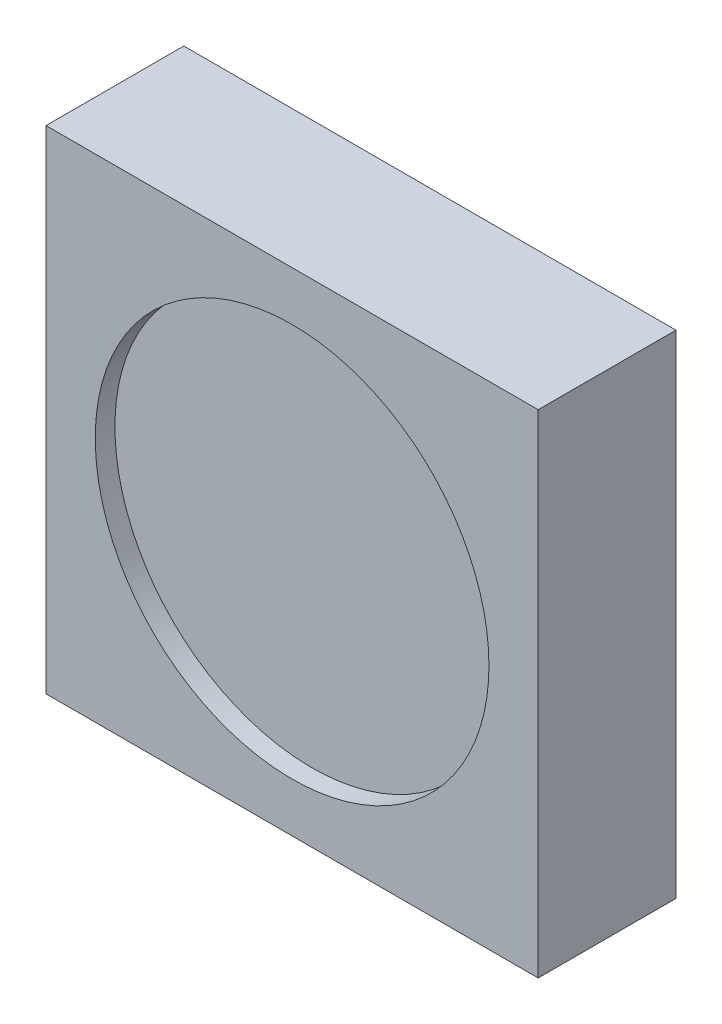
ISO-10303-21;
HEADER;
FILE_DESCRIPTION(('STEP AP214'),'2;1');
FILE_NAME('part.step','',(''),(''),'','','');
FILE_SCHEMA(('AUTOMOTIVE_DESIGN { 1 0 10303 214 1 1 1 1 }'));
ENDSEC;
DATA;
#1=APPLICATION_CONTEXT('core data for automotive mechanical design processes');
#2=APPLICATION_PROTOCOL_DEFINITION('international standard','automotive_design',2000,#1);
#3=PRODUCT_CONTEXT('',#1,'mechanical');
#4=PRODUCT('Part','Part','',(#3));
#5=PRODUCT_RELATED_PRODUCT_CATEGORY('part','',(#4));
#6=PRODUCT_DEFINITION_FORMATION('','',#4);
#7=PRODUCT_DEFINITION_CONTEXT('part definition',#1,'design');
#8=PRODUCT_DEFINITION('design','',#6,#7);
#9=PRODUCT_DEFINITION_SHAPE('','',#8);
#10=(LENGTH_UNIT() NAMED_UNIT(*) SI_UNIT(.MILLI.,.METRE.));
#11=(NAMED_UNIT(*) PLANE_ANGLE_UNIT() SI_UNIT($,.RADIAN.));
#12=(NAMED_UNIT(*) SI_UNIT($,.STERADIAN.) SOLID_ANGLE_UNIT());
#13=UNCERTAINTY_MEASURE_WITH_UNIT(LENGTH_MEASURE(1.E-05),#10,'distance_accuracy_value','');
#14=(GEOMETRIC_REPRESENTATION_CONTEXT(3) GLOBAL_UNCERTAINTY_ASSIGNED_CONTEXT((#13)) GLOBAL_UNIT_ASSIGNED_CONTEXT((#10,
#11,#12)) REPRESENTATION_CONTEXT('',''));
#15=CARTESIAN_POINT('',(0.,0.,0.));
#16=DIRECTION('',(0.,0.,1.));
#17=DIRECTION('',(1.,0.,0.));
#18=AXIS2_PLACEMENT_3D('',#15,#16,#17);
#19=CARTESIAN_POINT('',(2.5,2.5,1.4));
#20=DIRECTION('',(-1.,0.,0.));
#21=DIRECTION('',(0.,-1.,0.));
#22=AXIS2_PLACEMENT_3D('',#19,#20,#21);
#23=PLANE('',#22);
#24=DIRECTION('',(0.,1.,0.));
#25=VECTOR('',#24,1.);
#26=CARTESIAN_POINT('',(2.5,2.5,0.));
#27=LINE('',#26,#25);
#28=CARTESIAN_POINT('',(2.5,-2.5,0.));
#29=VERTEX_POINT('',#28);
#30=CARTESIAN_POINT('',(2.5,2.5,0.));
#31=VERTEX_POINT('',#30);
#32=EDGE_CURVE('E106',#29,#31,#27,.T.);
#33=ORIENTED_EDGE('',*,*,#32,.T.);
#34=DIRECTION('',(0.,0.,-1.));
#35=VECTOR('',#34,1.);
#36=CARTESIAN_POINT('',(2.5,2.5,1.4));
#37=LINE('',#36,#35);
#38=CARTESIAN_POINT('',(2.5,2.5,1.4));
#39=VERTEX_POINT('',#38);
#40=EDGE_CURVE('E11',#39,#31,#37,.T.);
#41=ORIENTED_EDGE('',*,*,#40,.F.);
#42=DIRECTION('',(0.,1.,0.));
#43=VECTOR('',#42,1.);
#44=CARTESIAN_POINT('',(2.5,2.5,1.4));
#45=LINE('',#44,#43);
#46=CARTESIAN_POINT('',(2.5,-2.5,1.4));
#47=VERTEX_POINT('',#46);
#48=EDGE_CURVE('E90',#47,#39,#45,.T.);
#49=ORIENTED_EDGE('',*,*,#48,.F.);
#50=DIRECTION('',(0.,0.,-1.));
#51=VECTOR('',#50,1.);
#52=CARTESIAN_POINT('',(2.5,-2.5,1.4));
#53=LINE('',#52,#51);
#54=EDGE_CURVE('E102',#47,#29,#53,.T.);
#55=ORIENTED_EDGE('',*,*,#54,.T.);
#56=EDGE_LOOP('',(#33,#41,#49,#55));
#57=FACE_BOUND('',#56,.T.);
#58=ADVANCED_FACE('F38',(#57),#23,.F.);
#59=CARTESIAN_POINT('',(-2.5,2.5,1.4));
#60=DIRECTION('',(0.,-1.,0.));
#61=DIRECTION('',(0.,0.,-1.));
#62=AXIS2_PLACEMENT_3D('',#59,#60,#61);
#63=PLANE('',#62);
#64=DIRECTION('',(-1.,0.,0.));
#65=VECTOR('',#64,1.);
#66=CARTESIAN_POINT('',(-2.5,2.5,0.));
#67=LINE('',#66,#65);
#68=CARTESIAN_POINT('',(-2.5,2.5,0.));
#69=VERTEX_POINT('',#68);
#70=EDGE_CURVE('E95',#31,#69,#67,.T.);
#71=ORIENTED_EDGE('',*,*,#70,.T.);
#72=DIRECTION('',(0.,0.,-1.));
#73=VECTOR('',#72,1.);
#74=CARTESIAN_POINT('',(-2.5,2.5,1.4));
#75=LINE('',#74,#73);
#76=CARTESIAN_POINT('',(-2.5,2.5,1.4));
#77=VERTEX_POINT('',#76);
#78=EDGE_CURVE('E47',#77,#69,#75,.T.);
#79=ORIENTED_EDGE('',*,*,#78,.F.);
#80=DIRECTION('',(-1.,0.,0.));
#81=VECTOR('',#80,1.);
#82=CARTESIAN_POINT('',(-2.5,2.5,1.4));
#83=LINE('',#82,#81);
#84=EDGE_CURVE('E85',#39,#77,#83,.T.);
#85=ORIENTED_EDGE('',*,*,#84,.F.);
#86=ORIENTED_EDGE('',*,*,#40,.T.);
#87=EDGE_LOOP('',(#71,#79,#85,#86));
#88=FACE_BOUND('',#87,.T.);
#89=ADVANCED_FACE('F94',(#88),#63,.F.);
#90=CARTESIAN_POINT('',(-2.5,2.5,1.4));
#91=DIRECTION('',(1.,0.,0.));
#92=DIRECTION('',(0.,1.,0.));
#93=AXIS2_PLACEMENT_3D('',#90,#91,#92);
#94=PLANE('',#93);
#95=DIRECTION('',(0.,-1.,0.));
#96=VECTOR('',#95,1.);
#97=CARTESIAN_POINT('',(-2.5,2.5,0.));
#98=LINE('',#97,#96);
#99=CARTESIAN_POINT('',(-2.5,-2.5,0.));
#100=VERTEX_POINT('',#99);
#101=EDGE_CURVE('E72',#69,#100,#98,.T.);
#102=ORIENTED_EDGE('',*,*,#101,.T.);
#103=DIRECTION('',(0.,0.,-1.));
#104=VECTOR('',#103,1.);
#105=CARTESIAN_POINT('',(-2.5,-2.5,1.4));
#106=LINE('',#105,#104);
#107=CARTESIAN_POINT('',(-2.5,-2.5,1.4));
#108=VERTEX_POINT('',#107);
#109=EDGE_CURVE('E97',#108,#100,#106,.T.);
#110=ORIENTED_EDGE('',*,*,#109,.F.);
#111=DIRECTION('',(0.,-1.,0.));
#112=VECTOR('',#111,1.);
#113=CARTESIAN_POINT('',(-2.5,2.5,1.4));
#114=LINE('',#113,#112);
#115=EDGE_CURVE('E88',#77,#108,#114,.T.);
#116=ORIENTED_EDGE('',*,*,#115,.F.);
#117=ORIENTED_EDGE('',*,*,#78,.T.);
#118=EDGE_LOOP('',(#102,#110,#116,#117));
#119=FACE_BOUND('',#118,.T.);
#120=ADVANCED_FACE('F98',(#119),#94,.F.);
#121=CARTESIAN_POINT('',(-2.5,-2.5,1.4));
#122=DIRECTION('',(0.,1.,0.));
#123=DIRECTION('',(0.,0.,1.));
#124=AXIS2_PLACEMENT_3D('',#121,#122,#123);
#125=PLANE('',#124);
#126=DIRECTION('',(1.,0.,0.));
#127=VECTOR('',#126,1.);
#128=CARTESIAN_POINT('',(-2.5,-2.5,0.));
#129=LINE('',#128,#127);
#130=EDGE_CURVE('E78',#100,#29,#129,.T.);
#131=ORIENTED_EDGE('',*,*,#130,.T.);
#132=ORIENTED_EDGE('',*,*,#54,.F.);
#133=DIRECTION('',(1.,0.,0.));
#134=VECTOR('',#133,1.);
#135=CARTESIAN_POINT('',(-2.5,-2.5,1.4));
#136=LINE('',#135,#134);
#137=EDGE_CURVE('E55',#108,#47,#136,.T.);
#138=ORIENTED_EDGE('',*,*,#137,.F.);
#139=ORIENTED_EDGE('',*,*,#109,.T.);
#140=EDGE_LOOP('',(#131,#132,#138,#139));
#141=FACE_BOUND('',#140,.T.);
#142=ADVANCED_FACE('F121',(#141),#125,.F.);
#143=CARTESIAN_POINT('',(0.,0.,1.4));
#144=DIRECTION('',(0.,0.,1.));
#145=DIRECTION('',(1.,0.,0.));
#146=AXIS2_PLACEMENT_3D('',#143,#144,#145);
#147=PLANE('',#146);
#148=CARTESIAN_POINT('',(0.,0.,1.4));
#149=DIRECTION('',(0.,0.,1.));
#150=DIRECTION('',(1.,0.,0.));
#151=AXIS2_PLACEMENT_3D('',#148,#149,#150);
#152=CIRCLE('',#151,2.);
#153=CARTESIAN_POINT('',(2.,0.,1.4));
#154=VERTEX_POINT('',#153);
#155=EDGE_CURVE('E127',#154,#154,#152,.T.);
#156=ORIENTED_EDGE('',*,*,#155,.F.);
#157=EDGE_LOOP('',(#156));
#158=FACE_BOUND('',#157,.T.);
#159=ORIENTED_EDGE('',*,*,#48,.T.);
#160=ORIENTED_EDGE('',*,*,#84,.T.);
#161=ORIENTED_EDGE('',*,*,#115,.T.);
#162=ORIENTED_EDGE('',*,*,#137,.T.);
#163=EDGE_LOOP('',(#159,#160,#161,#162));
#164=FACE_BOUND('',#163,.T.);
#165=ADVANCED_FACE('F86',(#158,#164),#147,.T.);
#166=CARTESIAN_POINT('',(0.,0.,0.));
#167=DIRECTION('',(0.,0.,1.));
#168=DIRECTION('',(1.,0.,0.));
#169=AXIS2_PLACEMENT_3D('',#166,#167,#168);
#170=PLANE('',#169);
#171=ORIENTED_EDGE('',*,*,#32,.F.);
#172=ORIENTED_EDGE('',*,*,#130,.F.);
#173=ORIENTED_EDGE('',*,*,#101,.F.);
#174=ORIENTED_EDGE('',*,*,#70,.F.);
#175=EDGE_LOOP('',(#171,#172,#173,#174));
#176=FACE_BOUND('',#175,.T.);
#177=ADVANCED_FACE('F124',(#176),#170,.F.);
#178=CARTESIAN_POINT('',(0.,0.,1.2));
#179=DIRECTION('',(0.,0.,1.));
#180=DIRECTION('',(1.,0.,0.));
#181=AXIS2_PLACEMENT_3D('',#178,#179,#180);
#182=CYLINDRICAL_SURFACE('',#181,2.);
#183=CARTESIAN_POINT('',(0.,0.,1.2));
#184=DIRECTION('',(0.,0.,1.));
#185=DIRECTION('',(1.,0.,0.));
#186=AXIS2_PLACEMENT_3D('',#183,#184,#185);
#187=CIRCLE('',#186,2.);
#188=CARTESIAN_POINT('',(2.,0.,1.2));
#189=VERTEX_POINT('',#188);
#190=EDGE_CURVE('E110',#189,#189,#187,.T.);
#191=ORIENTED_EDGE('',*,*,#190,.F.);
#192=EDGE_LOOP('',(#191));
#193=FACE_BOUND('',#192,.T.);
#194=ORIENTED_EDGE('',*,*,#155,.T.);
#195=EDGE_LOOP('',(#194));
#196=FACE_BOUND('',#195,.T.);
#197=ADVANCED_FACE('F137',(#193,#196),#182,.F.);
#198=CARTESIAN_POINT('',(0.,0.,1.2));
#199=DIRECTION('',(0.,0.,1.));
#200=DIRECTION('',(1.,0.,0.));
#201=AXIS2_PLACEMENT_3D('',#198,#199,#200);
#202=PLANE('',#201);
#203=ORIENTED_EDGE('',*,*,#190,.T.);
#204=EDGE_LOOP('',(#203));
#205=FACE_BOUND('',#204,.T.);
#206=ADVANCED_FACE('F135',(#205),#202,.T.);
#207=CLOSED_SHELL('',(#58,#89,#120,#142,#165,#177,#197,#206));
#208=MANIFOLD_SOLID_BREP('B2',#207);
#209=ADVANCED_BREP_SHAPE_REPRESENTATION('',(#18,#208),#14);
#210=SHAPE_DEFINITION_REPRESENTATION(#9,#209);
ENDSEC;
END-ISO-10303-21;
